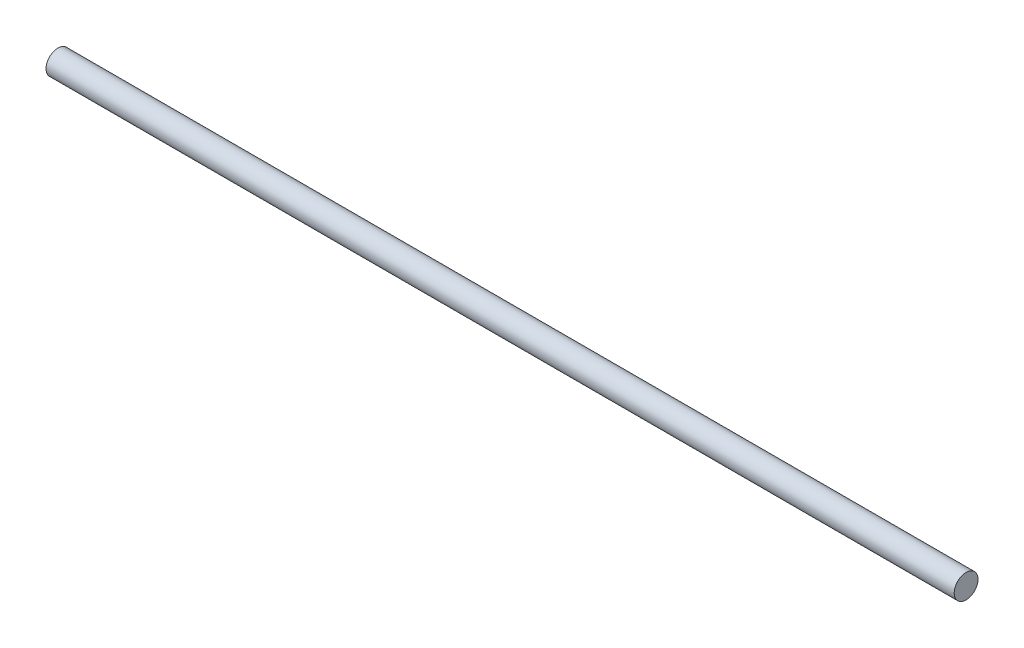
ISO-10303-21;
HEADER;
FILE_DESCRIPTION(('STEP AP214'),'2;1');
FILE_NAME('part.step','',(''),(''),'','','');
FILE_SCHEMA(('AUTOMOTIVE_DESIGN { 1 0 10303 214 1 1 1 1 }'));
ENDSEC;
DATA;
#1=APPLICATION_CONTEXT('core data for automotive mechanical design processes');
#2=APPLICATION_PROTOCOL_DEFINITION('international standard','automotive_design',2000,#1);
#3=PRODUCT_CONTEXT('',#1,'mechanical');
#4=PRODUCT('Part','Part','',(#3));
#5=PRODUCT_RELATED_PRODUCT_CATEGORY('part','',(#4));
#6=PRODUCT_DEFINITION_FORMATION('','',#4);
#7=PRODUCT_DEFINITION_CONTEXT('part definition',#1,'design');
#8=PRODUCT_DEFINITION('design','',#6,#7);
#9=PRODUCT_DEFINITION_SHAPE('','',#8);
#10=(LENGTH_UNIT() NAMED_UNIT(*) SI_UNIT(.MILLI.,.METRE.));
#11=(NAMED_UNIT(*) PLANE_ANGLE_UNIT() SI_UNIT($,.RADIAN.));
#12=(NAMED_UNIT(*) SI_UNIT($,.STERADIAN.) SOLID_ANGLE_UNIT());
#13=UNCERTAINTY_MEASURE_WITH_UNIT(LENGTH_MEASURE(1.E-05),#10,'distance_accuracy_value','');
#14=(GEOMETRIC_REPRESENTATION_CONTEXT(3) GLOBAL_UNCERTAINTY_ASSIGNED_CONTEXT((#13)) GLOBAL_UNIT_ASSIGNED_CONTEXT((#10,
#11,#12)) REPRESENTATION_CONTEXT('',''));
#15=CARTESIAN_POINT('',(0.,0.,0.));
#16=DIRECTION('',(0.,0.,1.));
#17=DIRECTION('',(1.,0.,0.));
#18=AXIS2_PLACEMENT_3D('',#15,#16,#17);
#19=CARTESIAN_POINT('',(304.8,0.,0.));
#20=DIRECTION('',(-1.,0.,0.));
#21=DIRECTION('',(0.,0.,1.));
#22=AXIS2_PLACEMENT_3D('',#19,#20,#21);
#23=CYLINDRICAL_SURFACE('',#22,8.);
#24=CARTESIAN_POINT('',(304.8,0.,0.));
#25=DIRECTION('',(1.,0.,0.));
#26=DIRECTION('',(0.,0.,-1.));
#27=AXIS2_PLACEMENT_3D('',#24,#25,#26);
#28=CIRCLE('',#27,8.);
#29=CARTESIAN_POINT('',(304.8,0.,8.));
#30=VERTEX_POINT('',#29);
#31=EDGE_CURVE('E10',#30,#30,#28,.T.);
#32=CARTESIAN_POINT('',(-304.8,0.,0.));
#33=DIRECTION('',(1.,0.,0.));
#34=DIRECTION('',(0.,0.,-1.));
#35=AXIS2_PLACEMENT_3D('',#32,#33,#34);
#36=CIRCLE('',#35,8.);
#37=CARTESIAN_POINT('',(-304.8,0.,8.));
#38=VERTEX_POINT('',#37);
#39=EDGE_CURVE('E34',#38,#38,#36,.T.);
#40=CARTESIAN_POINT('',(304.8,0.,8.));
#41=CARTESIAN_POINT('',(298.45,0.,8.));
#42=CARTESIAN_POINT('',(292.1,0.,8.));
#43=CARTESIAN_POINT('',(279.4,0.,8.));
#44=CARTESIAN_POINT('',(273.05,0.,8.));
#45=CARTESIAN_POINT('',(260.35,0.,8.));
#46=CARTESIAN_POINT('',(254.,0.,8.));
#47=CARTESIAN_POINT('',(241.3,0.,8.));
#48=CARTESIAN_POINT('',(234.95,0.,8.));
#49=CARTESIAN_POINT('',(222.25,0.,8.));
#50=CARTESIAN_POINT('',(215.9,0.,8.));
#51=CARTESIAN_POINT('',(203.2,0.,8.));
#52=CARTESIAN_POINT('',(196.85,0.,8.));
#53=CARTESIAN_POINT('',(184.15,0.,8.));
#54=CARTESIAN_POINT('',(177.8,0.,8.));
#55=CARTESIAN_POINT('',(165.1,0.,8.));
#56=CARTESIAN_POINT('',(158.75,0.,8.));
#57=CARTESIAN_POINT('',(146.05,0.,8.));
#58=CARTESIAN_POINT('',(139.7,0.,8.));
#59=CARTESIAN_POINT('',(127.,0.,8.));
#60=CARTESIAN_POINT('',(120.65,0.,8.));
#61=CARTESIAN_POINT('',(107.95,0.,8.));
#62=CARTESIAN_POINT('',(101.6,0.,8.));
#63=CARTESIAN_POINT('',(88.9,0.,8.));
#64=CARTESIAN_POINT('',(82.55,0.,8.));
#65=CARTESIAN_POINT('',(69.85,0.,8.));
#66=CARTESIAN_POINT('',(63.5,0.,8.));
#67=CARTESIAN_POINT('',(50.8,0.,8.));
#68=CARTESIAN_POINT('',(44.45,0.,8.));
#69=CARTESIAN_POINT('',(31.75,0.,8.));
#70=CARTESIAN_POINT('',(25.4,0.,8.));
#71=CARTESIAN_POINT('',(12.7,0.,8.));
#72=CARTESIAN_POINT('',(6.35,0.,8.));
#73=CARTESIAN_POINT('',(-6.35,0.,8.));
#74=CARTESIAN_POINT('',(-12.7,0.,8.));
#75=CARTESIAN_POINT('',(-25.4,0.,8.));
#76=CARTESIAN_POINT('',(-31.75,0.,8.));
#77=CARTESIAN_POINT('',(-44.45,0.,8.));
#78=CARTESIAN_POINT('',(-50.8,0.,8.));
#79=CARTESIAN_POINT('',(-63.5,0.,8.));
#80=CARTESIAN_POINT('',(-69.85,0.,8.));
#81=CARTESIAN_POINT('',(-82.55,0.,8.));
#82=CARTESIAN_POINT('',(-88.9,0.,8.));
#83=CARTESIAN_POINT('',(-101.6,0.,8.));
#84=CARTESIAN_POINT('',(-107.95,0.,8.));
#85=CARTESIAN_POINT('',(-120.65,0.,8.));
#86=CARTESIAN_POINT('',(-127.,0.,8.));
#87=CARTESIAN_POINT('',(-139.7,0.,8.));
#88=CARTESIAN_POINT('',(-146.05,0.,8.));
#89=CARTESIAN_POINT('',(-158.75,0.,8.));
#90=CARTESIAN_POINT('',(-165.1,0.,8.));
#91=CARTESIAN_POINT('',(-177.8,0.,8.));
#92=CARTESIAN_POINT('',(-184.15,0.,8.));
#93=CARTESIAN_POINT('',(-196.85,0.,8.));
#94=CARTESIAN_POINT('',(-203.2,0.,8.));
#95=CARTESIAN_POINT('',(-215.9,0.,8.));
#96=CARTESIAN_POINT('',(-222.25,0.,8.));
#97=CARTESIAN_POINT('',(-234.95,0.,8.));
#98=CARTESIAN_POINT('',(-241.3,0.,8.));
#99=CARTESIAN_POINT('',(-254.,0.,8.));
#100=CARTESIAN_POINT('',(-260.35,0.,8.));
#101=CARTESIAN_POINT('',(-273.05,0.,8.));
#102=CARTESIAN_POINT('',(-279.4,0.,8.));
#103=CARTESIAN_POINT('',(-292.1,0.,8.));
#104=CARTESIAN_POINT('',(-298.45,0.,8.));
#105=CARTESIAN_POINT('',(-304.8,0.,8.));
#106=B_SPLINE_CURVE_WITH_KNOTS('',3,(#40,#41,#42,#43,#44,#45,#46,#47,#48,#49,#50,#51,#52,#53,
#54,#55,#56,#57,#58,#59,#60,#61,#62,#63,#64,#65,#66,#67,#68,#69,#70,#71,#72,#73,#74,#75,#76,#77,
#78,#79,#80,#81,#82,#83,#84,#85,#86,#87,#88,#89,#90,#91,#92,#93,#94,#95,#96,#97,#98,#99,#100,
#101,#102,#103,#104,#105),.UNSPECIFIED.,.F.,.F.,(4,2,2,2,2,2,2,2,2,2,2,2,2,2,2,2,2,2,2,2,2,2,2,
2,2,2,2,2,2,2,2,2,4),(0.,19.05,38.1,57.15,76.2,95.2500000000001,114.3,133.35,152.4,171.45,190.5,
209.55,228.6,247.65,266.7,285.75,304.8,323.85,342.9,361.95,381.,400.05,419.1,438.15,457.2,
476.25,495.3,514.35,533.4,552.45,571.5,590.55,609.6),.UNSPECIFIED.);
#107=EDGE_CURVE('BSEAM31',#30,#38,#106,.T.);
#108=ORIENTED_EDGE('',*,*,#31,.F.);
#109=ORIENTED_EDGE('',*,*,#39,.T.);
#110=ORIENTED_EDGE('',*,*,#107,.T.);
#111=ORIENTED_EDGE('',*,*,#107,.F.);
#112=EDGE_LOOP('',(#108,#110,#109,#111));
#113=FACE_BOUND('',#112,.T.);
#114=ADVANCED_FACE('F31',(#113),#23,.T.);
#115=CARTESIAN_POINT('',(304.8,0.,0.));
#116=DIRECTION('',(1.,0.,0.));
#117=DIRECTION('',(0.,0.,-1.));
#118=AXIS2_PLACEMENT_3D('',#115,#116,#117);
#119=PLANE('',#118);
#120=ORIENTED_EDGE('',*,*,#31,.T.);
#121=EDGE_LOOP('',(#120));
#122=FACE_BOUND('',#121,.T.);
#123=ADVANCED_FACE('F46',(#122),#119,.T.);
#124=CARTESIAN_POINT('',(-304.8,0.,0.));
#125=DIRECTION('',(1.,0.,0.));
#126=DIRECTION('',(0.,0.,-1.));
#127=AXIS2_PLACEMENT_3D('',#124,#125,#126);
#128=PLANE('',#127);
#129=ORIENTED_EDGE('',*,*,#39,.F.);
#130=EDGE_LOOP('',(#129));
#131=FACE_BOUND('',#130,.T.);
#132=ADVANCED_FACE('F44',(#131),#128,.F.);
#133=CLOSED_SHELL('',(#114,#123,#132));
#134=MANIFOLD_SOLID_BREP('B2',#133);
#135=ADVANCED_BREP_SHAPE_REPRESENTATION('',(#18,#134),#14);
#136=SHAPE_DEFINITION_REPRESENTATION(#9,#135);
ENDSEC;
END-ISO-10303-21;
